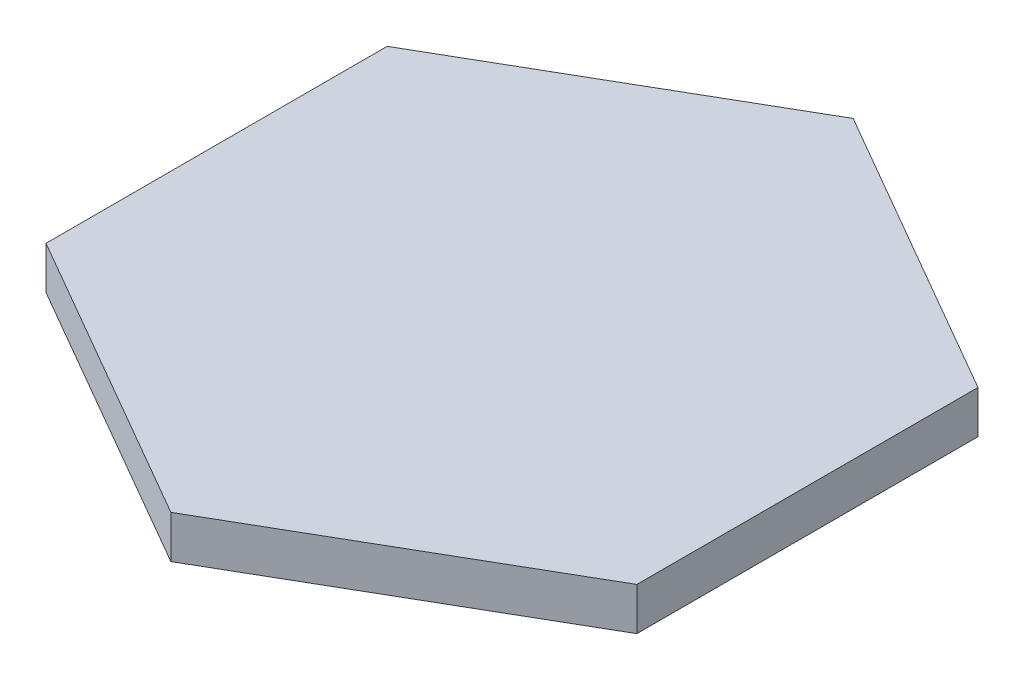
ISO-10303-21;
HEADER;
FILE_DESCRIPTION(('STEP AP214'),'2;1');
FILE_NAME('part.step','',(''),(''),'','','');
FILE_SCHEMA(('AUTOMOTIVE_DESIGN { 1 0 10303 214 1 1 1 1 }'));
ENDSEC;
DATA;
#1=APPLICATION_CONTEXT('core data for automotive mechanical design processes');
#2=APPLICATION_PROTOCOL_DEFINITION('international standard','automotive_design',2000,#1);
#3=PRODUCT_CONTEXT('',#1,'mechanical');
#4=PRODUCT('Part','Part','',(#3));
#5=PRODUCT_RELATED_PRODUCT_CATEGORY('part','',(#4));
#6=PRODUCT_DEFINITION_FORMATION('','',#4);
#7=PRODUCT_DEFINITION_CONTEXT('part definition',#1,'design');
#8=PRODUCT_DEFINITION('design','',#6,#7);
#9=PRODUCT_DEFINITION_SHAPE('','',#8);
#10=(LENGTH_UNIT() NAMED_UNIT(*) SI_UNIT(.MILLI.,.METRE.));
#11=(NAMED_UNIT(*) PLANE_ANGLE_UNIT() SI_UNIT($,.RADIAN.));
#12=(NAMED_UNIT(*) SI_UNIT($,.STERADIAN.) SOLID_ANGLE_UNIT());
#13=UNCERTAINTY_MEASURE_WITH_UNIT(LENGTH_MEASURE(1.E-05),#10,'distance_accuracy_value','');
#14=(GEOMETRIC_REPRESENTATION_CONTEXT(3) GLOBAL_UNCERTAINTY_ASSIGNED_CONTEXT((#13)) GLOBAL_UNIT_ASSIGNED_CONTEXT((#10,
#11,#12)) REPRESENTATION_CONTEXT('',''));
#15=CARTESIAN_POINT('',(0.,0.,0.));
#16=DIRECTION('',(0.,0.,1.));
#17=DIRECTION('',(1.,0.,0.));
#18=AXIS2_PLACEMENT_3D('',#15,#16,#17);
#19=CARTESIAN_POINT('',(43.9940905122495,-6.35,25.4));
#20=DIRECTION('',(1.,0.,0.));
#21=DIRECTION('',(0.,0.,-1.));
#22=AXIS2_PLACEMENT_3D('',#19,#20,#21);
#23=PLANE('',#22);
#24=DIRECTION('',(0.,0.,-1.));
#25=VECTOR('',#24,1.);
#26=CARTESIAN_POINT('',(43.9940905122495,0.,25.4));
#27=LINE('',#26,#25);
#28=CARTESIAN_POINT('',(43.9940905122495,0.,25.4));
#29=VERTEX_POINT('',#28);
#30=CARTESIAN_POINT('',(43.9940905122495,0.,-25.4));
#31=VERTEX_POINT('',#30);
#32=EDGE_CURVE('E124',#29,#31,#27,.T.);
#33=ORIENTED_EDGE('',*,*,#32,.F.);
#34=DIRECTION('',(0.,1.,0.));
#35=VECTOR('',#34,1.);
#36=CARTESIAN_POINT('',(43.9940905122495,-6.35,25.4));
#37=LINE('',#36,#35);
#38=CARTESIAN_POINT('',(43.9940905122495,-6.35,25.4));
#39=VERTEX_POINT('',#38);
#40=EDGE_CURVE('E11',#39,#29,#37,.T.);
#41=ORIENTED_EDGE('',*,*,#40,.F.);
#42=DIRECTION('',(0.,0.,-1.));
#43=VECTOR('',#42,1.);
#44=CARTESIAN_POINT('',(43.9940905122495,-6.35,25.4));
#45=LINE('',#44,#43);
#46=CARTESIAN_POINT('',(43.9940905122495,-6.35,-25.4));
#47=VERTEX_POINT('',#46);
#48=EDGE_CURVE('E138',#39,#47,#45,.T.);
#49=ORIENTED_EDGE('',*,*,#48,.T.);
#50=DIRECTION('',(0.,1.,0.));
#51=VECTOR('',#50,1.);
#52=CARTESIAN_POINT('',(43.9940905122495,-6.35,-25.4));
#53=LINE('',#52,#51);
#54=EDGE_CURVE('E42',#47,#31,#53,.T.);
#55=ORIENTED_EDGE('',*,*,#54,.T.);
#56=EDGE_LOOP('',(#33,#41,#49,#55));
#57=FACE_BOUND('',#56,.T.);
#58=ADVANCED_FACE('F39',(#57),#23,.T.);
#59=CARTESIAN_POINT('',(0.,-6.35,50.8));
#60=DIRECTION('',(0.5,0.,0.866025403784439));
#61=DIRECTION('',(0.866025403784439,0.,-0.5));
#62=AXIS2_PLACEMENT_3D('',#59,#60,#61);
#63=PLANE('',#62);
#64=DIRECTION('',(0.866025403784439,0.,-0.5));
#65=VECTOR('',#64,1.);
#66=CARTESIAN_POINT('',(0.,0.,50.8));
#67=LINE('',#66,#65);
#68=CARTESIAN_POINT('',(0.,0.,50.8));
#69=VERTEX_POINT('',#68);
#70=EDGE_CURVE('E136',#69,#29,#67,.T.);
#71=ORIENTED_EDGE('',*,*,#70,.F.);
#72=DIRECTION('',(0.,1.,0.));
#73=VECTOR('',#72,1.);
#74=CARTESIAN_POINT('',(0.,-6.35,50.8));
#75=LINE('',#74,#73);
#76=CARTESIAN_POINT('',(0.,-6.35,50.8));
#77=VERTEX_POINT('',#76);
#78=EDGE_CURVE('E48',#77,#69,#75,.T.);
#79=ORIENTED_EDGE('',*,*,#78,.F.);
#80=DIRECTION('',(0.866025403784439,0.,-0.5));
#81=VECTOR('',#80,1.);
#82=CARTESIAN_POINT('',(0.,-6.35,50.8));
#83=LINE('',#82,#81);
#84=EDGE_CURVE('E114',#77,#39,#83,.T.);
#85=ORIENTED_EDGE('',*,*,#84,.T.);
#86=ORIENTED_EDGE('',*,*,#40,.T.);
#87=EDGE_LOOP('',(#71,#79,#85,#86));
#88=FACE_BOUND('',#87,.T.);
#89=ADVANCED_FACE('F146',(#88),#63,.T.);
#90=CARTESIAN_POINT('',(-43.9940905122495,-6.35,25.4));
#91=DIRECTION('',(-0.5,0.,0.866025403784439));
#92=DIRECTION('',(0.866025403784439,0.,0.5));
#93=AXIS2_PLACEMENT_3D('',#90,#91,#92);
#94=PLANE('',#93);
#95=DIRECTION('',(0.866025403784439,0.,0.5));
#96=VECTOR('',#95,1.);
#97=CARTESIAN_POINT('',(-43.9940905122495,0.,25.4));
#98=LINE('',#97,#96);
#99=CARTESIAN_POINT('',(-43.9940905122495,0.,25.4));
#100=VERTEX_POINT('',#99);
#101=EDGE_CURVE('E101',#100,#69,#98,.T.);
#102=ORIENTED_EDGE('',*,*,#101,.F.);
#103=DIRECTION('',(0.,1.,0.));
#104=VECTOR('',#103,1.);
#105=CARTESIAN_POINT('',(-43.9940905122495,-6.35,25.4));
#106=LINE('',#105,#104);
#107=CARTESIAN_POINT('',(-43.9940905122495,-6.35,25.4));
#108=VERTEX_POINT('',#107);
#109=EDGE_CURVE('E96',#108,#100,#106,.T.);
#110=ORIENTED_EDGE('',*,*,#109,.F.);
#111=DIRECTION('',(0.866025403784439,0.,0.5));
#112=VECTOR('',#111,1.);
#113=CARTESIAN_POINT('',(-43.9940905122495,-6.35,25.4));
#114=LINE('',#113,#112);
#115=EDGE_CURVE('E99',#108,#77,#114,.T.);
#116=ORIENTED_EDGE('',*,*,#115,.T.);
#117=ORIENTED_EDGE('',*,*,#78,.T.);
#118=EDGE_LOOP('',(#102,#110,#116,#117));
#119=FACE_BOUND('',#118,.T.);
#120=ADVANCED_FACE('F98',(#119),#94,.T.);
#121=CARTESIAN_POINT('',(-43.9940905122495,-6.35,-25.4));
#122=DIRECTION('',(-1.,0.,0.));
#123=DIRECTION('',(0.,0.,1.));
#124=AXIS2_PLACEMENT_3D('',#121,#122,#123);
#125=PLANE('',#124);
#126=DIRECTION('',(0.,0.,1.));
#127=VECTOR('',#126,1.);
#128=CARTESIAN_POINT('',(-43.9940905122495,0.,-25.4));
#129=LINE('',#128,#127);
#130=CARTESIAN_POINT('',(-43.9940905122495,0.,-25.4));
#131=VERTEX_POINT('',#130);
#132=EDGE_CURVE('E133',#131,#100,#129,.T.);
#133=ORIENTED_EDGE('',*,*,#132,.F.);
#134=DIRECTION('',(0.,1.,0.));
#135=VECTOR('',#134,1.);
#136=CARTESIAN_POINT('',(-43.9940905122495,-6.35,-25.4));
#137=LINE('',#136,#135);
#138=CARTESIAN_POINT('',(-43.9940905122495,-6.35,-25.4));
#139=VERTEX_POINT('',#138);
#140=EDGE_CURVE('E106',#139,#131,#137,.T.);
#141=ORIENTED_EDGE('',*,*,#140,.F.);
#142=DIRECTION('',(0.,0.,1.));
#143=VECTOR('',#142,1.);
#144=CARTESIAN_POINT('',(-43.9940905122495,-6.35,-25.4));
#145=LINE('',#144,#143);
#146=EDGE_CURVE('E112',#139,#108,#145,.T.);
#147=ORIENTED_EDGE('',*,*,#146,.T.);
#148=ORIENTED_EDGE('',*,*,#109,.T.);
#149=EDGE_LOOP('',(#133,#141,#147,#148));
#150=FACE_BOUND('',#149,.T.);
#151=ADVANCED_FACE('F116',(#150),#125,.T.);
#152=CARTESIAN_POINT('',(0.,-6.35,-50.8));
#153=DIRECTION('',(-0.5,0.,-0.866025403784439));
#154=DIRECTION('',(-0.866025403784439,0.,0.5));
#155=AXIS2_PLACEMENT_3D('',#152,#153,#154);
#156=PLANE('',#155);
#157=DIRECTION('',(-0.866025403784438,0.,0.5));
#158=VECTOR('',#157,1.);
#159=CARTESIAN_POINT('',(0.,0.,-50.8));
#160=LINE('',#159,#158);
#161=CARTESIAN_POINT('',(0.,0.,-50.8));
#162=VERTEX_POINT('',#161);
#163=EDGE_CURVE('E130',#162,#131,#160,.T.);
#164=ORIENTED_EDGE('',*,*,#163,.F.);
#165=DIRECTION('',(0.,1.,0.));
#166=VECTOR('',#165,1.);
#167=CARTESIAN_POINT('',(0.,-6.35,-50.8));
#168=LINE('',#167,#166);
#169=CARTESIAN_POINT('',(0.,-6.35,-50.8));
#170=VERTEX_POINT('',#169);
#171=EDGE_CURVE('E141',#170,#162,#168,.T.);
#172=ORIENTED_EDGE('',*,*,#171,.F.);
#173=DIRECTION('',(-0.866025403784438,0.,0.5));
#174=VECTOR('',#173,1.);
#175=CARTESIAN_POINT('',(0.,-6.35,-50.8));
#176=LINE('',#175,#174);
#177=EDGE_CURVE('E117',#170,#139,#176,.T.);
#178=ORIENTED_EDGE('',*,*,#177,.T.);
#179=ORIENTED_EDGE('',*,*,#140,.T.);
#180=EDGE_LOOP('',(#164,#172,#178,#179));
#181=FACE_BOUND('',#180,.T.);
#182=ADVANCED_FACE('F159',(#181),#156,.T.);
#183=CARTESIAN_POINT('',(43.9940905122495,-6.35,-25.4));
#184=DIRECTION('',(0.5,0.,-0.866025403784439));
#185=DIRECTION('',(-0.866025403784439,0.,-0.5));
#186=AXIS2_PLACEMENT_3D('',#183,#184,#185);
#187=PLANE('',#186);
#188=DIRECTION('',(-0.866025403784438,0.,-0.5));
#189=VECTOR('',#188,1.);
#190=CARTESIAN_POINT('',(43.9940905122495,0.,-25.4));
#191=LINE('',#190,#189);
#192=EDGE_CURVE('E127',#31,#162,#191,.T.);
#193=ORIENTED_EDGE('',*,*,#192,.F.);
#194=ORIENTED_EDGE('',*,*,#54,.F.);
#195=DIRECTION('',(-0.866025403784438,0.,-0.5));
#196=VECTOR('',#195,1.);
#197=CARTESIAN_POINT('',(43.9940905122495,-6.35,-25.4));
#198=LINE('',#197,#196);
#199=EDGE_CURVE('E119',#47,#170,#198,.T.);
#200=ORIENTED_EDGE('',*,*,#199,.T.);
#201=ORIENTED_EDGE('',*,*,#171,.T.);
#202=EDGE_LOOP('',(#193,#194,#200,#201));
#203=FACE_BOUND('',#202,.T.);
#204=ADVANCED_FACE('F143',(#203),#187,.T.);
#205=CARTESIAN_POINT('',(0.,-6.35,0.));
#206=DIRECTION('',(0.,1.,0.));
#207=DIRECTION('',(0.,0.,1.));
#208=AXIS2_PLACEMENT_3D('',#205,#206,#207);
#209=PLANE('',#208);
#210=ORIENTED_EDGE('',*,*,#48,.F.);
#211=ORIENTED_EDGE('',*,*,#84,.F.);
#212=ORIENTED_EDGE('',*,*,#115,.F.);
#213=ORIENTED_EDGE('',*,*,#146,.F.);
#214=ORIENTED_EDGE('',*,*,#177,.F.);
#215=ORIENTED_EDGE('',*,*,#199,.F.);
#216=EDGE_LOOP('',(#210,#211,#212,#213,#214,#215));
#217=FACE_BOUND('',#216,.T.);
#218=ADVANCED_FACE('F110',(#217),#209,.F.);
#219=CARTESIAN_POINT('',(0.,0.,0.));
#220=DIRECTION('',(0.,1.,0.));
#221=DIRECTION('',(0.,0.,1.));
#222=AXIS2_PLACEMENT_3D('',#219,#220,#221);
#223=PLANE('',#222);
#224=ORIENTED_EDGE('',*,*,#32,.T.);
#225=ORIENTED_EDGE('',*,*,#192,.T.);
#226=ORIENTED_EDGE('',*,*,#163,.T.);
#227=ORIENTED_EDGE('',*,*,#132,.T.);
#228=ORIENTED_EDGE('',*,*,#101,.T.);
#229=ORIENTED_EDGE('',*,*,#70,.T.);
#230=EDGE_LOOP('',(#224,#225,#226,#227,#228,#229));
#231=FACE_BOUND('',#230,.T.);
#232=ADVANCED_FACE('F145',(#231),#223,.T.);
#233=CLOSED_SHELL('',(#58,#89,#120,#151,#182,#204,#218,#232));
#234=MANIFOLD_SOLID_BREP('B2',#233);
#235=ADVANCED_BREP_SHAPE_REPRESENTATION('',(#18,#234),#14);
#236=SHAPE_DEFINITION_REPRESENTATION(#9,#235);
ENDSEC;
END-ISO-10303-21;
